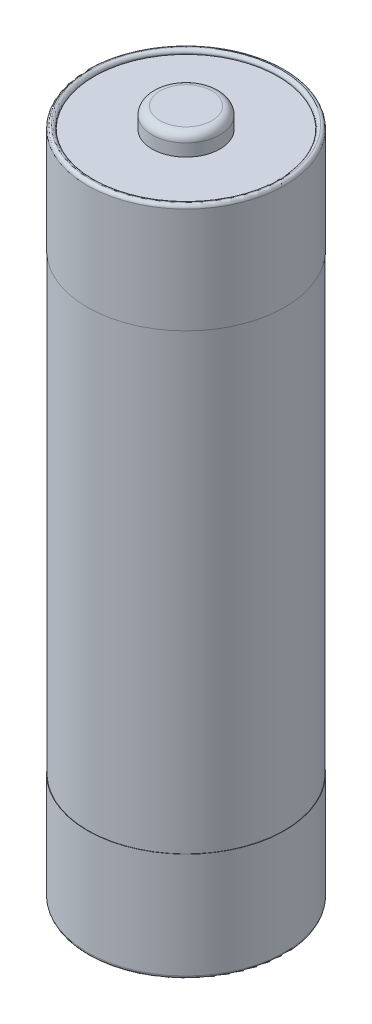
ISO-10303-21;
HEADER;
FILE_DESCRIPTION(('STEP AP214'),'2;1');
FILE_NAME('part.step','',(''),(''),'','','');
FILE_SCHEMA(('AUTOMOTIVE_DESIGN { 1 0 10303 214 1 1 1 1 }'));
ENDSEC;
DATA;
#1=APPLICATION_CONTEXT('core data for automotive mechanical design processes');
#2=APPLICATION_PROTOCOL_DEFINITION('international standard','automotive_design',2000,#1);
#3=PRODUCT_CONTEXT('',#1,'mechanical');
#4=PRODUCT('Part','Part','',(#3));
#5=PRODUCT_RELATED_PRODUCT_CATEGORY('part','',(#4));
#6=PRODUCT_DEFINITION_FORMATION('','',#4);
#7=PRODUCT_DEFINITION_CONTEXT('part definition',#1,'design');
#8=PRODUCT_DEFINITION('design','',#6,#7);
#9=PRODUCT_DEFINITION_SHAPE('','',#8);
#10=(LENGTH_UNIT() NAMED_UNIT(*) SI_UNIT(.MILLI.,.METRE.));
#11=(NAMED_UNIT(*) PLANE_ANGLE_UNIT() SI_UNIT($,.RADIAN.));
#12=(NAMED_UNIT(*) SI_UNIT($,.STERADIAN.) SOLID_ANGLE_UNIT());
#13=UNCERTAINTY_MEASURE_WITH_UNIT(LENGTH_MEASURE(1.E-05),#10,'distance_accuracy_value','');
#14=(GEOMETRIC_REPRESENTATION_CONTEXT(3) GLOBAL_UNCERTAINTY_ASSIGNED_CONTEXT((#13)) GLOBAL_UNIT_ASSIGNED_CONTEXT((#10,
#11,#12)) REPRESENTATION_CONTEXT('',''));
#15=CARTESIAN_POINT('',(0.,0.,0.));
#16=DIRECTION('',(0.,0.,1.));
#17=DIRECTION('',(1.,0.,0.));
#18=AXIS2_PLACEMENT_3D('',#15,#16,#17);
#19=CARTESIAN_POINT('',(0.,8.,0.));
#20=DIRECTION('',(0.,-1.,0.));
#21=DIRECTION('',(0.,0.,-1.));
#22=AXIS2_PLACEMENT_3D('',#19,#20,#21);
#23=CYLINDRICAL_SURFACE('',#22,7.25);
#24=CARTESIAN_POINT('',(0.,0.25,0.));
#25=DIRECTION('',(0.,1.,0.));
#26=DIRECTION('',(0.,0.,1.));
#27=AXIS2_PLACEMENT_3D('',#24,#25,#26);
#28=CIRCLE('',#27,7.25);
#29=CARTESIAN_POINT('',(0.,0.25,7.25));
#30=VERTEX_POINT('',#29);
#31=EDGE_CURVE('E60',#30,#30,#28,.T.);
#32=ORIENTED_EDGE('',*,*,#31,.T.);
#33=EDGE_LOOP('',(#32));
#34=FACE_BOUND('',#33,.T.);
#35=CARTESIAN_POINT('',(0.,8.,0.));
#36=DIRECTION('',(0.,1.,0.));
#37=DIRECTION('',(0.,0.,1.));
#38=AXIS2_PLACEMENT_3D('',#35,#36,#37);
#39=CIRCLE('',#38,7.25);
#40=CARTESIAN_POINT('',(0.,8.,7.25));
#41=VERTEX_POINT('',#40);
#42=EDGE_CURVE('E75',#41,#41,#39,.T.);
#43=ORIENTED_EDGE('',*,*,#42,.F.);
#44=EDGE_LOOP('',(#43));
#45=FACE_BOUND('',#44,.T.);
#46=ADVANCED_FACE('F33',(#34,#45),#23,.T.);
#47=CARTESIAN_POINT('',(0.,8.,0.));
#48=DIRECTION('',(0.,1.,0.));
#49=DIRECTION('',(0.,0.,1.));
#50=AXIS2_PLACEMENT_3D('',#47,#48,#49);
#51=PLANE('',#50);
#52=CARTESIAN_POINT('',(0.,8.,0.));
#53=DIRECTION('',(0.,1.,0.));
#54=DIRECTION('',(0.,0.,1.));
#55=AXIS2_PLACEMENT_3D('',#52,#53,#54);
#56=CIRCLE('',#55,7.225);
#57=CARTESIAN_POINT('',(0.,8.,7.225));
#58=VERTEX_POINT('',#57);
#59=EDGE_CURVE('E79',#58,#58,#56,.T.);
#60=ORIENTED_EDGE('',*,*,#59,.F.);
#61=EDGE_LOOP('',(#60));
#62=FACE_BOUND('',#61,.T.);
#63=ORIENTED_EDGE('',*,*,#42,.T.);
#64=EDGE_LOOP('',(#63));
#65=FACE_BOUND('',#64,.T.);
#66=ADVANCED_FACE('F113',(#62,#65),#51,.T.);
#67=CARTESIAN_POINT('',(0.,41.3,0.));
#68=DIRECTION('',(0.,-1.,0.));
#69=DIRECTION('',(0.,0.,-1.));
#70=AXIS2_PLACEMENT_3D('',#67,#68,#69);
#71=CYLINDRICAL_SURFACE('',#70,7.225);
#72=CARTESIAN_POINT('',(0.,41.3,0.));
#73=DIRECTION('',(0.,1.,0.));
#74=DIRECTION('',(0.,0.,1.));
#75=AXIS2_PLACEMENT_3D('',#72,#73,#74);
#76=CIRCLE('',#75,7.225);
#77=CARTESIAN_POINT('',(0.,41.3,7.225));
#78=VERTEX_POINT('',#77);
#79=EDGE_CURVE('E78',#78,#78,#76,.T.);
#80=ORIENTED_EDGE('',*,*,#79,.F.);
#81=EDGE_LOOP('',(#80));
#82=FACE_BOUND('',#81,.T.);
#83=ORIENTED_EDGE('',*,*,#59,.T.);
#84=EDGE_LOOP('',(#83));
#85=FACE_BOUND('',#84,.T.);
#86=ADVANCED_FACE('F119',(#82,#85),#71,.T.);
#87=CARTESIAN_POINT('',(0.,49.3,0.));
#88=DIRECTION('',(0.,-1.,0.));
#89=DIRECTION('',(0.,0.,-1.));
#90=AXIS2_PLACEMENT_3D('',#87,#88,#89);
#91=CYLINDRICAL_SURFACE('',#90,7.25);
#92=CARTESIAN_POINT('',(0.,49.05,0.));
#93=DIRECTION('',(0.,1.,0.));
#94=DIRECTION('',(0.,0.,1.));
#95=AXIS2_PLACEMENT_3D('',#92,#93,#94);
#96=CIRCLE('',#95,7.25);
#97=CARTESIAN_POINT('',(0.,49.05,7.25));
#98=VERTEX_POINT('',#97);
#99=EDGE_CURVE('E66',#98,#98,#96,.F.);
#100=ORIENTED_EDGE('',*,*,#99,.T.);
#101=EDGE_LOOP('',(#100));
#102=FACE_BOUND('',#101,.T.);
#103=CARTESIAN_POINT('',(0.,41.3,0.));
#104=DIRECTION('',(0.,1.,0.));
#105=DIRECTION('',(0.,0.,1.));
#106=AXIS2_PLACEMENT_3D('',#103,#104,#105);
#107=CIRCLE('',#106,7.25);
#108=CARTESIAN_POINT('',(0.,41.3,7.25));
#109=VERTEX_POINT('',#108);
#110=EDGE_CURVE('E82',#109,#109,#107,.T.);
#111=ORIENTED_EDGE('',*,*,#110,.T.);
#112=EDGE_LOOP('',(#111));
#113=FACE_BOUND('',#112,.T.);
#114=ADVANCED_FACE('F247',(#102,#113),#91,.T.);
#115=CARTESIAN_POINT('',(0.,41.3,0.));
#116=DIRECTION('',(0.,1.,0.));
#117=DIRECTION('',(0.,0.,1.));
#118=AXIS2_PLACEMENT_3D('',#115,#116,#117);
#119=PLANE('',#118);
#120=ORIENTED_EDGE('',*,*,#79,.T.);
#121=EDGE_LOOP('',(#120));
#122=FACE_BOUND('',#121,.T.);
#123=ORIENTED_EDGE('',*,*,#110,.F.);
#124=EDGE_LOOP('',(#123));
#125=FACE_BOUND('',#124,.T.);
#126=ADVANCED_FACE('F252',(#122,#125),#119,.F.);
#127=CARTESIAN_POINT('',(0.,49.,0.));
#128=DIRECTION('',(0.,1.,0.));
#129=DIRECTION('',(0.,0.,1.));
#130=AXIS2_PLACEMENT_3D('',#127,#128,#129);
#131=CYLINDRICAL_SURFACE('',#130,6.75);
#132=CARTESIAN_POINT('',(0.,49.05,0.));
#133=DIRECTION('',(0.,1.,0.));
#134=DIRECTION('',(0.,0.,1.));
#135=AXIS2_PLACEMENT_3D('',#132,#133,#134);
#136=CIRCLE('',#135,6.75);
#137=CARTESIAN_POINT('',(0.,49.05,6.75));
#138=VERTEX_POINT('',#137);
#139=EDGE_CURVE('E63',#138,#138,#136,.T.);
#140=ORIENTED_EDGE('',*,*,#139,.T.);
#141=EDGE_LOOP('',(#140));
#142=FACE_BOUND('',#141,.T.);
#143=CARTESIAN_POINT('',(0.,49.,0.));
#144=DIRECTION('',(0.,1.,0.));
#145=DIRECTION('',(0.,0.,1.));
#146=AXIS2_PLACEMENT_3D('',#143,#144,#145);
#147=CIRCLE('',#146,6.75);
#148=CARTESIAN_POINT('',(0.,49.,6.75));
#149=VERTEX_POINT('',#148);
#150=EDGE_CURVE('E87',#149,#149,#147,.T.);
#151=ORIENTED_EDGE('',*,*,#150,.F.);
#152=EDGE_LOOP('',(#151));
#153=FACE_BOUND('',#152,.T.);
#154=ADVANCED_FACE('F262',(#142,#153),#131,.F.);
#155=CARTESIAN_POINT('',(0.,49.,0.));
#156=DIRECTION('',(0.,1.,0.));
#157=DIRECTION('',(0.,0.,1.));
#158=AXIS2_PLACEMENT_3D('',#155,#156,#157);
#159=PLANE('',#158);
#160=CARTESIAN_POINT('',(0.,49.,0.));
#161=DIRECTION('',(0.,1.,0.));
#162=DIRECTION('',(0.,0.,1.));
#163=AXIS2_PLACEMENT_3D('',#160,#161,#162);
#164=CIRCLE('',#163,2.5);
#165=CARTESIAN_POINT('',(0.,49.,2.5));
#166=VERTEX_POINT('',#165);
#167=EDGE_CURVE('E90',#166,#166,#164,.T.);
#168=ORIENTED_EDGE('',*,*,#167,.F.);
#169=EDGE_LOOP('',(#168));
#170=FACE_BOUND('',#169,.T.);
#171=ORIENTED_EDGE('',*,*,#150,.T.);
#172=EDGE_LOOP('',(#171));
#173=FACE_BOUND('',#172,.T.);
#174=ADVANCED_FACE('F220',(#170,#173),#159,.T.);
#175=CARTESIAN_POINT('',(0.,50.5,0.));
#176=DIRECTION('',(0.,-1.,0.));
#177=DIRECTION('',(0.,0.,-1.));
#178=AXIS2_PLACEMENT_3D('',#175,#176,#177);
#179=CYLINDRICAL_SURFACE('',#178,2.5);
#180=CARTESIAN_POINT('',(0.,49.9,0.));
#181=DIRECTION('',(0.,1.,0.));
#182=DIRECTION('',(0.,0.,1.));
#183=AXIS2_PLACEMENT_3D('',#180,#181,#182);
#184=CIRCLE('',#183,2.5);
#185=CARTESIAN_POINT('',(0.,49.9,2.5));
#186=VERTEX_POINT('',#185);
#187=EDGE_CURVE('E69',#186,#186,#184,.F.);
#188=ORIENTED_EDGE('',*,*,#187,.T.);
#189=EDGE_LOOP('',(#188));
#190=FACE_BOUND('',#189,.T.);
#191=ORIENTED_EDGE('',*,*,#167,.T.);
#192=EDGE_LOOP('',(#191));
#193=FACE_BOUND('',#192,.T.);
#194=ADVANCED_FACE('F109',(#190,#193),#179,.T.);
#195=CARTESIAN_POINT('',(0.,50.5,0.));
#196=DIRECTION('',(0.,1.,0.));
#197=DIRECTION('',(0.,0.,1.));
#198=AXIS2_PLACEMENT_3D('',#195,#196,#197);
#199=PLANE('',#198);
#200=CARTESIAN_POINT('',(0.,50.5,0.));
#201=DIRECTION('',(0.,1.,0.));
#202=DIRECTION('',(0.,0.,1.));
#203=AXIS2_PLACEMENT_3D('',#200,#201,#202);
#204=CIRCLE('',#203,1.9);
#205=CARTESIAN_POINT('',(0.,50.5,1.9));
#206=VERTEX_POINT('',#205);
#207=EDGE_CURVE('E72',#206,#206,#204,.T.);
#208=ORIENTED_EDGE('',*,*,#207,.T.);
#209=EDGE_LOOP('',(#208));
#210=FACE_BOUND('',#209,.T.);
#211=ADVANCED_FACE('F100',(#210),#199,.T.);
#212=CARTESIAN_POINT('',(0.,0.3,0.));
#213=DIRECTION('',(0.,-1.,0.));
#214=DIRECTION('',(0.,0.,-1.));
#215=AXIS2_PLACEMENT_3D('',#212,#213,#214);
#216=CYLINDRICAL_SURFACE('',#215,6.75);
#217=CARTESIAN_POINT('',(0.,0.25,0.));
#218=DIRECTION('',(0.,1.,0.));
#219=DIRECTION('',(0.,0.,1.));
#220=AXIS2_PLACEMENT_3D('',#217,#218,#219);
#221=CIRCLE('',#220,6.75);
#222=CARTESIAN_POINT('',(0.,0.25,6.75));
#223=VERTEX_POINT('',#222);
#224=EDGE_CURVE('E48',#223,#223,#221,.F.);
#225=ORIENTED_EDGE('',*,*,#224,.T.);
#226=EDGE_LOOP('',(#225));
#227=FACE_BOUND('',#226,.T.);
#228=CARTESIAN_POINT('',(0.,0.3,0.));
#229=DIRECTION('',(0.,-1.,0.));
#230=DIRECTION('',(0.,0.,-1.));
#231=AXIS2_PLACEMENT_3D('',#228,#229,#230);
#232=CIRCLE('',#231,6.75);
#233=CARTESIAN_POINT('',(0.,0.3,-6.75));
#234=VERTEX_POINT('',#233);
#235=EDGE_CURVE('E57',#234,#234,#232,.T.);
#236=ORIENTED_EDGE('',*,*,#235,.F.);
#237=EDGE_LOOP('',(#236));
#238=FACE_BOUND('',#237,.T.);
#239=ADVANCED_FACE('F98',(#227,#238),#216,.F.);
#240=CARTESIAN_POINT('',(0.,0.3,0.));
#241=DIRECTION('',(0.,-1.,0.));
#242=DIRECTION('',(0.,0.,-1.));
#243=AXIS2_PLACEMENT_3D('',#240,#241,#242);
#244=PLANE('',#243);
#245=CARTESIAN_POINT('',(0.,0.3,0.));
#246=DIRECTION('',(0.,-1.,0.));
#247=DIRECTION('',(0.,0.,-1.));
#248=AXIS2_PLACEMENT_3D('',#245,#246,#247);
#249=CIRCLE('',#248,3.89372539331938);
#250=CARTESIAN_POINT('',(0.,0.3,-3.89372539331938));
#251=VERTEX_POINT('',#250);
#252=EDGE_CURVE('E10',#251,#251,#249,.F.);
#253=ORIENTED_EDGE('',*,*,#252,.T.);
#254=EDGE_LOOP('',(#253));
#255=FACE_BOUND('',#254,.T.);
#256=ORIENTED_EDGE('',*,*,#235,.T.);
#257=EDGE_LOOP('',(#256));
#258=FACE_BOUND('',#257,.T.);
#259=ADVANCED_FACE('F96',(#255,#258),#244,.T.);
#260=CARTESIAN_POINT('',(0.,-0.4,0.));
#261=DIRECTION('',(0.,-1.,0.));
#262=DIRECTION('',(0.,0.,-1.));
#263=AXIS2_PLACEMENT_3D('',#260,#261,#262);
#264=PLANE('',#263);
#265=CARTESIAN_POINT('',(0.,-0.4,0.));
#266=DIRECTION('',(0.,-1.,0.));
#267=DIRECTION('',(0.,0.,-1.));
#268=AXIS2_PLACEMENT_3D('',#265,#266,#267);
#269=CIRCLE('',#268,3.1);
#270=CARTESIAN_POINT('',(0.,-0.4,-3.1));
#271=VERTEX_POINT('',#270);
#272=EDGE_CURVE('E44',#271,#271,#269,.T.);
#273=ORIENTED_EDGE('',*,*,#272,.T.);
#274=EDGE_LOOP('',(#273));
#275=FACE_BOUND('',#274,.T.);
#276=ADVANCED_FACE('F107',(#275),#264,.T.);
#277=CARTESIAN_POINT('',(0.,49.9,0.));
#278=DIRECTION('',(0.,1.,0.));
#279=DIRECTION('',(0.,0.,1.));
#280=AXIS2_PLACEMENT_3D('',#277,#278,#279);
#281=TOROIDAL_SURFACE('',#280,1.9,0.6);
#282=ORIENTED_EDGE('',*,*,#187,.F.);
#283=EDGE_LOOP('',(#282));
#284=FACE_BOUND('',#283,.T.);
#285=ORIENTED_EDGE('',*,*,#207,.F.);
#286=EDGE_LOOP('',(#285));
#287=FACE_BOUND('',#286,.T.);
#288=ADVANCED_FACE('F125',(#284,#287),#281,.T.);
#289=CARTESIAN_POINT('',(0.,49.05,0.));
#290=DIRECTION('',(0.,1.,0.));
#291=DIRECTION('',(0.,0.,1.));
#292=AXIS2_PLACEMENT_3D('',#289,#290,#291);
#293=TOROIDAL_SURFACE('',#292,7.,0.25);
#294=ORIENTED_EDGE('',*,*,#139,.F.);
#295=EDGE_LOOP('',(#294));
#296=FACE_BOUND('',#295,.T.);
#297=CARTESIAN_POINT('',(0.,49.3,0.));
#298=DIRECTION('',(0.,1.,0.));
#299=DIRECTION('',(0.,0.,1.));
#300=AXIS2_PLACEMENT_3D('',#297,#298,#299);
#301=CIRCLE('',#300,7.);
#302=CARTESIAN_POINT('',(0.,49.3,7.));
#303=VERTEX_POINT('',#302);
#304=EDGE_CURVE('E54',#303,#303,#301,.F.);
#305=ORIENTED_EDGE('',*,*,#304,.F.);
#306=EDGE_LOOP('',(#305));
#307=FACE_BOUND('',#306,.T.);
#308=ADVANCED_FACE('F128',(#296,#307),#293,.T.);
#309=CARTESIAN_POINT('',(0.,49.05,0.));
#310=DIRECTION('',(0.,1.,0.));
#311=DIRECTION('',(0.,0.,1.));
#312=AXIS2_PLACEMENT_3D('',#309,#310,#311);
#313=TOROIDAL_SURFACE('',#312,7.,0.25);
#314=ORIENTED_EDGE('',*,*,#99,.F.);
#315=EDGE_LOOP('',(#314));
#316=FACE_BOUND('',#315,.T.);
#317=ORIENTED_EDGE('',*,*,#304,.T.);
#318=EDGE_LOOP('',(#317));
#319=FACE_BOUND('',#318,.T.);
#320=ADVANCED_FACE('F130',(#316,#319),#313,.T.);
#321=CARTESIAN_POINT('',(0.,0.25,0.));
#322=DIRECTION('',(0.,1.,0.));
#323=DIRECTION('',(0.,0.,1.));
#324=AXIS2_PLACEMENT_3D('',#321,#322,#323);
#325=TOROIDAL_SURFACE('',#324,7.,0.25);
#326=ORIENTED_EDGE('',*,*,#224,.F.);
#327=EDGE_LOOP('',(#326));
#328=FACE_BOUND('',#327,.T.);
#329=CARTESIAN_POINT('',(0.,0.,0.));
#330=DIRECTION('',(0.,1.,0.));
#331=DIRECTION('',(0.,0.,1.));
#332=AXIS2_PLACEMENT_3D('',#329,#330,#331);
#333=CIRCLE('',#332,7.);
#334=CARTESIAN_POINT('',(0.,0.,7.));
#335=VERTEX_POINT('',#334);
#336=EDGE_CURVE('E51',#335,#335,#333,.T.);
#337=ORIENTED_EDGE('',*,*,#336,.F.);
#338=EDGE_LOOP('',(#337));
#339=FACE_BOUND('',#338,.T.);
#340=ADVANCED_FACE('F133',(#328,#339),#325,.T.);
#341=CARTESIAN_POINT('',(0.,0.25,0.));
#342=DIRECTION('',(0.,1.,0.));
#343=DIRECTION('',(0.,0.,1.));
#344=AXIS2_PLACEMENT_3D('',#341,#342,#343);
#345=TOROIDAL_SURFACE('',#344,7.,0.25);
#346=ORIENTED_EDGE('',*,*,#336,.T.);
#347=EDGE_LOOP('',(#346));
#348=FACE_BOUND('',#347,.T.);
#349=ORIENTED_EDGE('',*,*,#31,.F.);
#350=EDGE_LOOP('',(#349));
#351=FACE_BOUND('',#350,.T.);
#352=ADVANCED_FACE('F138',(#348,#351),#345,.T.);
#353=CARTESIAN_POINT('',(0.,0.,0.));
#354=DIRECTION('',(0.,-1.,0.));
#355=DIRECTION('',(0.,0.,-1.));
#356=AXIS2_PLACEMENT_3D('',#353,#354,#355);
#357=TOROIDAL_SURFACE('',#356,3.1,0.4);
#358=CARTESIAN_POINT('',(0.,-0.0499999999999997,0.));
#359=DIRECTION('',(0.,1.,0.));
#360=DIRECTION('',(0.,0.,1.));
#361=AXIS2_PLACEMENT_3D('',#358,#359,#360);
#362=CIRCLE('',#361,3.49686269665969);
#363=CARTESIAN_POINT('',(0.,-0.0499999999999997,3.49686269665969));
#364=VERTEX_POINT('',#363);
#365=EDGE_CURVE('E40',#364,#364,#362,.F.);
#366=ORIENTED_EDGE('',*,*,#365,.T.);
#367=EDGE_LOOP('',(#366));
#368=FACE_BOUND('',#367,.T.);
#369=ORIENTED_EDGE('',*,*,#272,.F.);
#370=EDGE_LOOP('',(#369));
#371=FACE_BOUND('',#370,.T.);
#372=ADVANCED_FACE('F141',(#368,#371),#357,.T.);
#373=CARTESIAN_POINT('',(0.,-0.1,0.));
#374=DIRECTION('',(0.,-1.,0.));
#375=DIRECTION('',(0.,0.,-1.));
#376=AXIS2_PLACEMENT_3D('',#373,#374,#375);
#377=TOROIDAL_SURFACE('',#376,3.89372539331938,0.4);
#378=ORIENTED_EDGE('',*,*,#252,.F.);
#379=EDGE_LOOP('',(#378));
#380=FACE_BOUND('',#379,.T.);
#381=ORIENTED_EDGE('',*,*,#365,.F.);
#382=EDGE_LOOP('',(#381));
#383=FACE_BOUND('',#382,.T.);
#384=ADVANCED_FACE('F35',(#380,#383),#377,.F.);
#385=CLOSED_SHELL('',(#46,#66,#86,#114,#126,#154,#174,#194,#211,#239,#259,#276,#288,#308,#320,
#340,#352,#372,#384));
#386=MANIFOLD_SOLID_BREP('B2',#385);
#387=ADVANCED_BREP_SHAPE_REPRESENTATION('',(#18,#386),#14);
#388=SHAPE_DEFINITION_REPRESENTATION(#9,#387);
ENDSEC;
END-ISO-10303-21;
